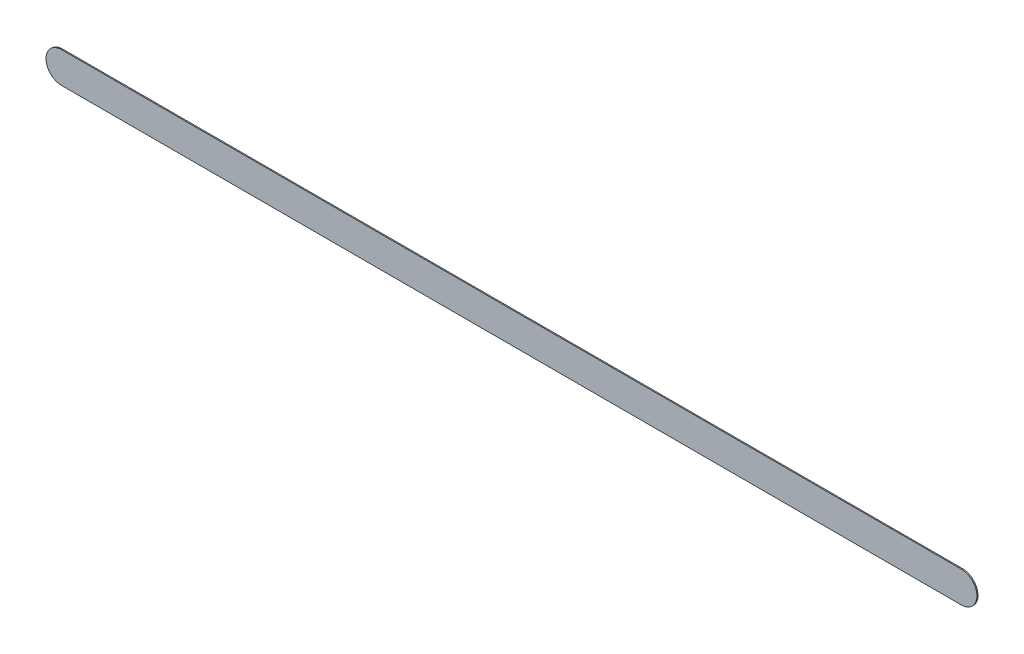
ISO-10303-21;
HEADER;
FILE_DESCRIPTION(('STEP AP214'),'2;1');
FILE_NAME('part.step','',(''),(''),'','','');
FILE_SCHEMA(('AUTOMOTIVE_DESIGN { 1 0 10303 214 1 1 1 1 }'));
ENDSEC;
DATA;
#1=APPLICATION_CONTEXT('core data for automotive mechanical design processes');
#2=APPLICATION_PROTOCOL_DEFINITION('international standard','automotive_design',2000,#1);
#3=PRODUCT_CONTEXT('',#1,'mechanical');
#4=PRODUCT('Part','Part','',(#3));
#5=PRODUCT_RELATED_PRODUCT_CATEGORY('part','',(#4));
#6=PRODUCT_DEFINITION_FORMATION('','',#4);
#7=PRODUCT_DEFINITION_CONTEXT('part definition',#1,'design');
#8=PRODUCT_DEFINITION('design','',#6,#7);
#9=PRODUCT_DEFINITION_SHAPE('','',#8);
#10=(LENGTH_UNIT() NAMED_UNIT(*) SI_UNIT(.MILLI.,.METRE.));
#11=(NAMED_UNIT(*) PLANE_ANGLE_UNIT() SI_UNIT($,.RADIAN.));
#12=(NAMED_UNIT(*) SI_UNIT($,.STERADIAN.) SOLID_ANGLE_UNIT());
#13=UNCERTAINTY_MEASURE_WITH_UNIT(LENGTH_MEASURE(1.E-05),#10,'distance_accuracy_value','');
#14=(GEOMETRIC_REPRESENTATION_CONTEXT(3) GLOBAL_UNCERTAINTY_ASSIGNED_CONTEXT((#13)) GLOBAL_UNIT_ASSIGNED_CONTEXT((#10,
#11,#12)) REPRESENTATION_CONTEXT('',''));
#15=CARTESIAN_POINT('',(0.,0.,0.));
#16=DIRECTION('',(0.,0.,1.));
#17=DIRECTION('',(1.,0.,0.));
#18=AXIS2_PLACEMENT_3D('',#15,#16,#17);
#19=CARTESIAN_POINT('',(154.33,-94.26,1.635));
#20=DIRECTION('',(0.,0.,1.));
#21=DIRECTION('',(1.,0.,0.));
#22=AXIS2_PLACEMENT_3D('',#19,#20,#21);
#23=PLANE('',#22);
#24=DIRECTION('',(-1.,0.,0.));
#25=VECTOR('',#24,1.);
#26=CARTESIAN_POINT('',(154.33,-94.26,1.635));
#27=LINE('',#26,#25);
#28=CARTESIAN_POINT('',(154.33,-94.26,1.635));
#29=VERTEX_POINT('',#28);
#30=CARTESIAN_POINT('',(125.34,-94.26,1.635));
#31=VERTEX_POINT('',#30);
#32=EDGE_CURVE('E81',#29,#31,#27,.T.);
#33=ORIENTED_EDGE('',*,*,#32,.T.);
#34=CARTESIAN_POINT('',(125.34,-94.76,1.635));
#35=DIRECTION('',(0.,0.,1.));
#36=DIRECTION('',(0.,1.,0.));
#37=AXIS2_PLACEMENT_3D('',#34,#35,#36);
#38=CIRCLE('',#37,0.5);
#39=CARTESIAN_POINT('',(125.34,-95.26,1.635));
#40=VERTEX_POINT('',#39);
#41=EDGE_CURVE('E99',#31,#40,#38,.T.);
#42=ORIENTED_EDGE('',*,*,#41,.T.);
#43=DIRECTION('',(1.,0.,0.));
#44=VECTOR('',#43,1.);
#45=CARTESIAN_POINT('',(125.34,-95.26,1.635));
#46=LINE('',#45,#44);
#47=CARTESIAN_POINT('',(154.33,-95.26,1.635));
#48=VERTEX_POINT('',#47);
#49=EDGE_CURVE('E74',#40,#48,#46,.T.);
#50=ORIENTED_EDGE('',*,*,#49,.T.);
#51=CARTESIAN_POINT('',(154.33,-94.76,1.635));
#52=DIRECTION('',(0.,0.,1.));
#53=DIRECTION('',(0.,-1.,0.));
#54=AXIS2_PLACEMENT_3D('',#51,#52,#53);
#55=CIRCLE('',#54,0.5);
#56=EDGE_CURVE('E11',#48,#29,#55,.T.);
#57=ORIENTED_EDGE('',*,*,#56,.T.);
#58=EDGE_LOOP('',(#33,#42,#50,#57));
#59=FACE_BOUND('',#58,.T.);
#60=ADVANCED_FACE('F17',(#59),#23,.T.);
#61=CARTESIAN_POINT('',(154.33,-94.26,1.6));
#62=DIRECTION('',(0.,0.,1.));
#63=DIRECTION('',(1.,0.,0.));
#64=AXIS2_PLACEMENT_3D('',#61,#62,#63);
#65=PLANE('',#64);
#66=CARTESIAN_POINT('',(154.33,-94.76,1.6));
#67=DIRECTION('',(0.,0.,1.));
#68=DIRECTION('',(0.,-1.,0.));
#69=AXIS2_PLACEMENT_3D('',#66,#67,#68);
#70=CIRCLE('',#69,0.5);
#71=CARTESIAN_POINT('',(154.33,-95.26,1.6));
#72=VERTEX_POINT('',#71);
#73=CARTESIAN_POINT('',(154.33,-94.26,1.6));
#74=VERTEX_POINT('',#73);
#75=EDGE_CURVE('E25',#72,#74,#70,.T.);
#76=ORIENTED_EDGE('',*,*,#75,.F.);
#77=DIRECTION('',(1.,0.,0.));
#78=VECTOR('',#77,1.);
#79=CARTESIAN_POINT('',(125.34,-95.26,1.6));
#80=LINE('',#79,#78);
#81=CARTESIAN_POINT('',(125.34,-95.26,1.6));
#82=VERTEX_POINT('',#81);
#83=EDGE_CURVE('E97',#82,#72,#80,.T.);
#84=ORIENTED_EDGE('',*,*,#83,.F.);
#85=CARTESIAN_POINT('',(125.34,-94.76,1.6));
#86=DIRECTION('',(0.,0.,1.));
#87=DIRECTION('',(0.,1.,0.));
#88=AXIS2_PLACEMENT_3D('',#85,#86,#87);
#89=CIRCLE('',#88,0.5);
#90=CARTESIAN_POINT('',(125.34,-94.26,1.6));
#91=VERTEX_POINT('',#90);
#92=EDGE_CURVE('E83',#91,#82,#89,.T.);
#93=ORIENTED_EDGE('',*,*,#92,.F.);
#94=DIRECTION('',(-1.,0.,0.));
#95=VECTOR('',#94,1.);
#96=CARTESIAN_POINT('',(154.33,-94.26,1.6));
#97=LINE('',#96,#95);
#98=EDGE_CURVE('E79',#74,#91,#97,.T.);
#99=ORIENTED_EDGE('',*,*,#98,.F.);
#100=EDGE_LOOP('',(#76,#84,#93,#99));
#101=FACE_BOUND('',#100,.T.);
#102=ADVANCED_FACE('F85',(#101),#65,.F.);
#103=CARTESIAN_POINT('',(154.33,-94.76,1.6));
#104=DIRECTION('',(0.,0.,-1.));
#105=DIRECTION('',(0.,-1.,0.));
#106=AXIS2_PLACEMENT_3D('',#103,#104,#105);
#107=CYLINDRICAL_SURFACE('',#106,0.5);
#108=ORIENTED_EDGE('',*,*,#75,.T.);
#109=DIRECTION('',(0.,0.,1.));
#110=VECTOR('',#109,1.);
#111=CARTESIAN_POINT('',(154.33,-94.26,1.6));
#112=LINE('',#111,#110);
#113=EDGE_CURVE('E68',#74,#29,#112,.T.);
#114=ORIENTED_EDGE('',*,*,#113,.T.);
#115=ORIENTED_EDGE('',*,*,#56,.F.);
#116=DIRECTION('',(0.,0.,1.));
#117=VECTOR('',#116,1.);
#118=CARTESIAN_POINT('',(154.33,-95.26,1.6));
#119=LINE('',#118,#117);
#120=EDGE_CURVE('E71',#72,#48,#119,.T.);
#121=ORIENTED_EDGE('',*,*,#120,.F.);
#122=EDGE_LOOP('',(#108,#114,#115,#121));
#123=FACE_BOUND('',#122,.T.);
#124=ADVANCED_FACE('F67',(#123),#107,.T.);
#125=CARTESIAN_POINT('',(125.34,-95.26,1.6));
#126=DIRECTION('',(0.,1.,0.));
#127=DIRECTION('',(1.,0.,0.));
#128=AXIS2_PLACEMENT_3D('',#125,#126,#127);
#129=PLANE('',#128);
#130=ORIENTED_EDGE('',*,*,#83,.T.);
#131=ORIENTED_EDGE('',*,*,#120,.T.);
#132=ORIENTED_EDGE('',*,*,#49,.F.);
#133=DIRECTION('',(0.,0.,1.));
#134=VECTOR('',#133,1.);
#135=CARTESIAN_POINT('',(125.34,-95.26,1.6));
#136=LINE('',#135,#134);
#137=EDGE_CURVE('E101',#82,#40,#136,.T.);
#138=ORIENTED_EDGE('',*,*,#137,.F.);
#139=EDGE_LOOP('',(#130,#131,#132,#138));
#140=FACE_BOUND('',#139,.T.);
#141=ADVANCED_FACE('F120',(#140),#129,.F.);
#142=CARTESIAN_POINT('',(125.34,-94.76,1.6));
#143=DIRECTION('',(0.,0.,-1.));
#144=DIRECTION('',(0.,1.,0.));
#145=AXIS2_PLACEMENT_3D('',#142,#143,#144);
#146=CYLINDRICAL_SURFACE('',#145,0.5);
#147=ORIENTED_EDGE('',*,*,#92,.T.);
#148=ORIENTED_EDGE('',*,*,#137,.T.);
#149=ORIENTED_EDGE('',*,*,#41,.F.);
#150=DIRECTION('',(0.,0.,1.));
#151=VECTOR('',#150,1.);
#152=CARTESIAN_POINT('',(125.34,-94.26,1.6));
#153=LINE('',#152,#151);
#154=EDGE_CURVE('E89',#91,#31,#153,.T.);
#155=ORIENTED_EDGE('',*,*,#154,.F.);
#156=EDGE_LOOP('',(#147,#148,#149,#155));
#157=FACE_BOUND('',#156,.T.);
#158=ADVANCED_FACE('F122',(#157),#146,.T.);
#159=CARTESIAN_POINT('',(154.33,-94.26,1.6));
#160=DIRECTION('',(0.,-1.,0.));
#161=DIRECTION('',(0.,0.,-1.));
#162=AXIS2_PLACEMENT_3D('',#159,#160,#161);
#163=PLANE('',#162);
#164=ORIENTED_EDGE('',*,*,#98,.T.);
#165=ORIENTED_EDGE('',*,*,#154,.T.);
#166=ORIENTED_EDGE('',*,*,#32,.F.);
#167=ORIENTED_EDGE('',*,*,#113,.F.);
#168=EDGE_LOOP('',(#164,#165,#166,#167));
#169=FACE_BOUND('',#168,.T.);
#170=ADVANCED_FACE('F77',(#169),#163,.F.);
#171=CLOSED_SHELL('',(#60,#102,#124,#141,#158,#170));
#172=MANIFOLD_SOLID_BREP('B1',#171);
#173=ADVANCED_BREP_SHAPE_REPRESENTATION('',(#18,#172),#14);
#174=SHAPE_DEFINITION_REPRESENTATION(#9,#173);
ENDSEC;
END-ISO-10303-21;
